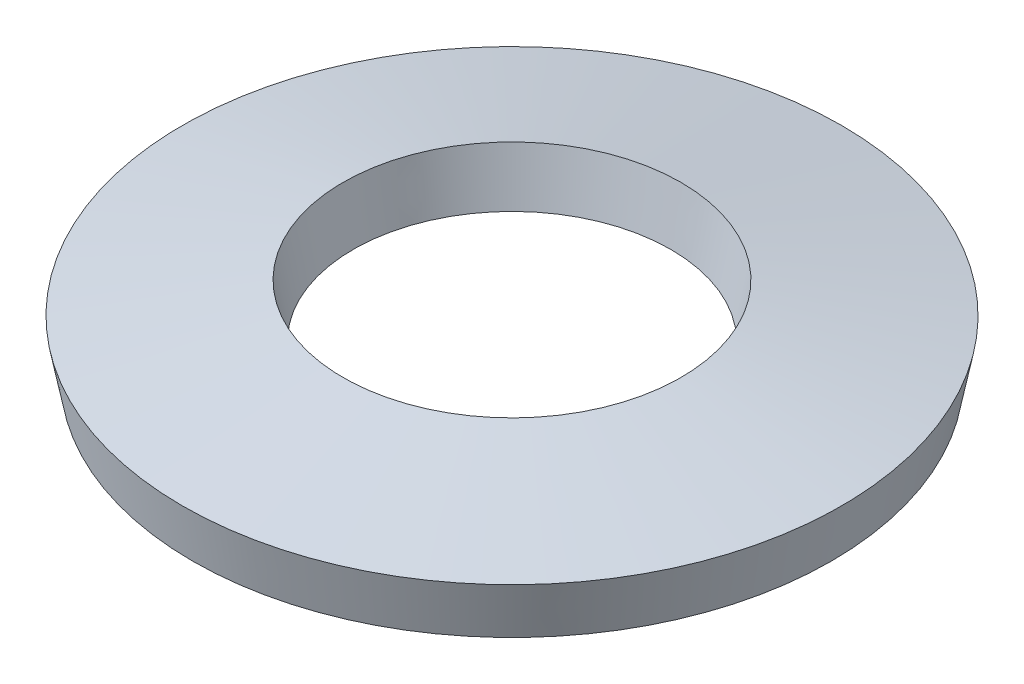
ISO-10303-21;
HEADER;
FILE_DESCRIPTION(('STEP AP214'),'2;1');
FILE_NAME('part.step','',(''),(''),'','','');
FILE_SCHEMA(('AUTOMOTIVE_DESIGN { 1 0 10303 214 1 1 1 1 }'));
ENDSEC;
DATA;
#1=APPLICATION_CONTEXT('core data for automotive mechanical design processes');
#2=APPLICATION_PROTOCOL_DEFINITION('international standard','automotive_design',2000,#1);
#3=PRODUCT_CONTEXT('',#1,'mechanical');
#4=PRODUCT('Part','Part','',(#3));
#5=PRODUCT_RELATED_PRODUCT_CATEGORY('part','',(#4));
#6=PRODUCT_DEFINITION_FORMATION('','',#4);
#7=PRODUCT_DEFINITION_CONTEXT('part definition',#1,'design');
#8=PRODUCT_DEFINITION('design','',#6,#7);
#9=PRODUCT_DEFINITION_SHAPE('','',#8);
#10=(LENGTH_UNIT() NAMED_UNIT(*) SI_UNIT(.MILLI.,.METRE.));
#11=(NAMED_UNIT(*) PLANE_ANGLE_UNIT() SI_UNIT($,.RADIAN.));
#12=(NAMED_UNIT(*) SI_UNIT($,.STERADIAN.) SOLID_ANGLE_UNIT());
#13=UNCERTAINTY_MEASURE_WITH_UNIT(LENGTH_MEASURE(1.E-05),#10,'distance_accuracy_value','');
#14=(GEOMETRIC_REPRESENTATION_CONTEXT(3) GLOBAL_UNCERTAINTY_ASSIGNED_CONTEXT((#13)) GLOBAL_UNIT_ASSIGNED_CONTEXT((#10,
#11,#12)) REPRESENTATION_CONTEXT('',''));
#15=CARTESIAN_POINT('',(0.,0.,0.));
#16=DIRECTION('',(0.,0.,1.));
#17=DIRECTION('',(1.,0.,0.));
#18=AXIS2_PLACEMENT_3D('',#15,#16,#17);
#19=CARTESIAN_POINT('',(0.,0.,0.));
#20=DIRECTION('',(0.,1.,0.));
#21=DIRECTION('',(0.,0.,1.));
#22=AXIS2_PLACEMENT_3D('',#19,#20,#21);
#23=CONICAL_SURFACE('',#22,5.32974658913634,0.190317280759798);
#24=CARTESIAN_POINT('',(0.,0.88374983795715,0.));
#25=DIRECTION('',(0.,-1.,0.));
#26=DIRECTION('',(0.,0.,-1.));
#27=AXIS2_PLACEMENT_3D('',#24,#25,#26);
#28=CIRCLE('',#27,5.5);
#29=CARTESIAN_POINT('',(0.,0.88374983795715,-5.5));
#30=VERTEX_POINT('',#29);
#31=EDGE_CURVE('E49',#30,#30,#28,.T.);
#32=ORIENTED_EDGE('',*,*,#31,.T.);
#33=EDGE_LOOP('',(#32));
#34=FACE_BOUND('',#33,.T.);
#35=CARTESIAN_POINT('',(0.,0.,0.));
#36=DIRECTION('',(0.,-1.,0.));
#37=DIRECTION('',(0.,0.,-1.));
#38=AXIS2_PLACEMENT_3D('',#35,#36,#37);
#39=CIRCLE('',#38,5.32974658913634);
#40=CARTESIAN_POINT('',(0.,0.,-5.32974658913634));
#41=VERTEX_POINT('',#40);
#42=EDGE_CURVE('E10',#41,#41,#39,.T.);
#43=ORIENTED_EDGE('',*,*,#42,.F.);
#44=EDGE_LOOP('',(#43));
#45=FACE_BOUND('',#44,.T.);
#46=ADVANCED_FACE('F35',(#34,#45),#23,.T.);
#47=CARTESIAN_POINT('',(0.,0.51625016204285,0.));
#48=DIRECTION('',(0.,-1.,0.));
#49=DIRECTION('',(0.,0.,-1.));
#50=AXIS2_PLACEMENT_3D('',#47,#48,#49);
#51=CONICAL_SURFACE('',#50,2.65,1.3804790460351);
#52=ORIENTED_EDGE('',*,*,#42,.T.);
#53=EDGE_LOOP('',(#52));
#54=FACE_BOUND('',#53,.T.);
#55=CARTESIAN_POINT('',(0.,0.51625016204285,0.));
#56=DIRECTION('',(0.,-1.,0.));
#57=DIRECTION('',(0.,0.,-1.));
#58=AXIS2_PLACEMENT_3D('',#55,#56,#57);
#59=CIRCLE('',#58,2.65);
#60=CARTESIAN_POINT('',(0.,0.51625016204285,-2.65));
#61=VERTEX_POINT('',#60);
#62=EDGE_CURVE('E41',#61,#61,#59,.T.);
#63=ORIENTED_EDGE('',*,*,#62,.F.);
#64=EDGE_LOOP('',(#63));
#65=FACE_BOUND('',#64,.T.);
#66=ADVANCED_FACE('F65',(#54,#65),#51,.F.);
#67=CARTESIAN_POINT('',(0.,1.4,0.));
#68=DIRECTION('',(0.,1.,0.));
#69=DIRECTION('',(0.,0.,1.));
#70=AXIS2_PLACEMENT_3D('',#67,#68,#69);
#71=CONICAL_SURFACE('',#70,2.82025341086366,0.190317280759797);
#72=ORIENTED_EDGE('',*,*,#62,.T.);
#73=EDGE_LOOP('',(#72));
#74=FACE_BOUND('',#73,.T.);
#75=CARTESIAN_POINT('',(0.,1.4,0.));
#76=DIRECTION('',(0.,-1.,0.));
#77=DIRECTION('',(0.,0.,-1.));
#78=AXIS2_PLACEMENT_3D('',#75,#76,#77);
#79=CIRCLE('',#78,2.82025341086366);
#80=CARTESIAN_POINT('',(0.,1.4,-2.82025341086366));
#81=VERTEX_POINT('',#80);
#82=EDGE_CURVE('E45',#81,#81,#79,.T.);
#83=ORIENTED_EDGE('',*,*,#82,.F.);
#84=EDGE_LOOP('',(#83));
#85=FACE_BOUND('',#84,.T.);
#86=ADVANCED_FACE('F59',(#74,#85),#71,.F.);
#87=CARTESIAN_POINT('',(0.,0.88374983795715,0.));
#88=DIRECTION('',(0.,-1.,0.));
#89=DIRECTION('',(0.,0.,-1.));
#90=AXIS2_PLACEMENT_3D('',#87,#88,#89);
#91=CONICAL_SURFACE('',#90,5.5,1.3804790460351);
#92=ORIENTED_EDGE('',*,*,#82,.T.);
#93=EDGE_LOOP('',(#92));
#94=FACE_BOUND('',#93,.T.);
#95=ORIENTED_EDGE('',*,*,#31,.F.);
#96=EDGE_LOOP('',(#95));
#97=FACE_BOUND('',#96,.T.);
#98=ADVANCED_FACE('F57',(#94,#97),#91,.T.);
#99=CLOSED_SHELL('',(#46,#66,#86,#98));
#100=MANIFOLD_SOLID_BREP('B2',#99);
#101=ADVANCED_BREP_SHAPE_REPRESENTATION('',(#18,#100),#14);
#102=SHAPE_DEFINITION_REPRESENTATION(#9,#101);
ENDSEC;
END-ISO-10303-21;
